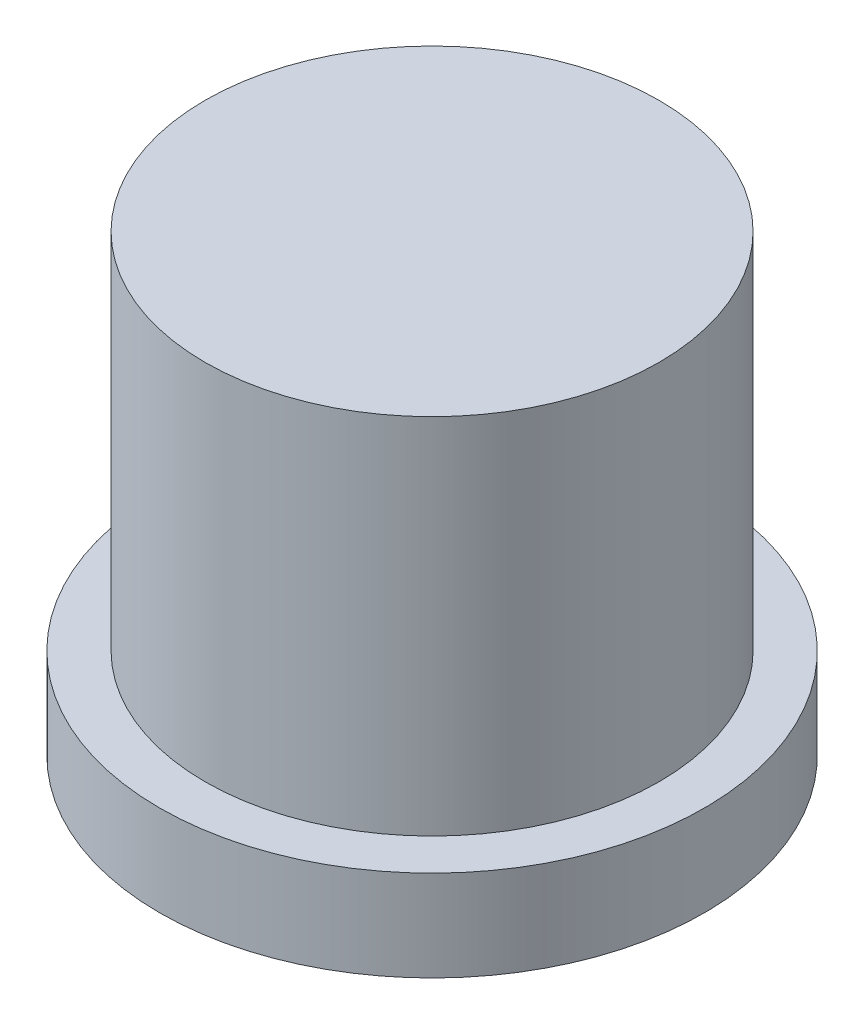
ISO-10303-21;
HEADER;
FILE_DESCRIPTION(('STEP AP214'),'2;1');
FILE_NAME('part.step','',(''),(''),'','','');
FILE_SCHEMA(('AUTOMOTIVE_DESIGN { 1 0 10303 214 1 1 1 1 }'));
ENDSEC;
DATA;
#1=APPLICATION_CONTEXT('core data for automotive mechanical design processes');
#2=APPLICATION_PROTOCOL_DEFINITION('international standard','automotive_design',2000,#1);
#3=PRODUCT_CONTEXT('',#1,'mechanical');
#4=PRODUCT('Part','Part','',(#3));
#5=PRODUCT_RELATED_PRODUCT_CATEGORY('part','',(#4));
#6=PRODUCT_DEFINITION_FORMATION('','',#4);
#7=PRODUCT_DEFINITION_CONTEXT('part definition',#1,'design');
#8=PRODUCT_DEFINITION('design','',#6,#7);
#9=PRODUCT_DEFINITION_SHAPE('','',#8);
#10=(LENGTH_UNIT() NAMED_UNIT(*) SI_UNIT(.MILLI.,.METRE.));
#11=(NAMED_UNIT(*) PLANE_ANGLE_UNIT() SI_UNIT($,.RADIAN.));
#12=(NAMED_UNIT(*) SI_UNIT($,.STERADIAN.) SOLID_ANGLE_UNIT());
#13=UNCERTAINTY_MEASURE_WITH_UNIT(LENGTH_MEASURE(1.E-05),#10,'distance_accuracy_value','');
#14=(GEOMETRIC_REPRESENTATION_CONTEXT(3) GLOBAL_UNCERTAINTY_ASSIGNED_CONTEXT((#13)) GLOBAL_UNIT_ASSIGNED_CONTEXT((#10,
#11,#12)) REPRESENTATION_CONTEXT('',''));
#15=CARTESIAN_POINT('',(0.,0.,0.));
#16=DIRECTION('',(0.,0.,1.));
#17=DIRECTION('',(1.,0.,0.));
#18=AXIS2_PLACEMENT_3D('',#15,#16,#17);
#19=CARTESIAN_POINT('',(0.,10.,0.));
#20=DIRECTION('',(0.,-1.,0.));
#21=DIRECTION('',(0.,0.,-1.));
#22=AXIS2_PLACEMENT_3D('',#19,#20,#21);
#23=CYLINDRICAL_SURFACE('',#22,5.);
#24=CARTESIAN_POINT('',(0.,2.,0.));
#25=DIRECTION('',(0.,1.,0.));
#26=DIRECTION('',(0.,0.,1.));
#27=AXIS2_PLACEMENT_3D('',#24,#25,#26);
#28=CIRCLE('',#27,5.);
#29=CARTESIAN_POINT('',(0.,2.,5.));
#30=VERTEX_POINT('',#29);
#31=EDGE_CURVE('E49',#30,#30,#28,.T.);
#32=ORIENTED_EDGE('',*,*,#31,.T.);
#33=EDGE_LOOP('',(#32));
#34=FACE_BOUND('',#33,.T.);
#35=CARTESIAN_POINT('',(0.,10.,0.));
#36=DIRECTION('',(0.,1.,0.));
#37=DIRECTION('',(0.,0.,1.));
#38=AXIS2_PLACEMENT_3D('',#35,#36,#37);
#39=CIRCLE('',#38,5.);
#40=CARTESIAN_POINT('',(0.,10.,5.));
#41=VERTEX_POINT('',#40);
#42=EDGE_CURVE('E10',#41,#41,#39,.T.);
#43=ORIENTED_EDGE('',*,*,#42,.F.);
#44=EDGE_LOOP('',(#43));
#45=FACE_BOUND('',#44,.T.);
#46=ADVANCED_FACE('F34',(#34,#45),#23,.T.);
#47=CARTESIAN_POINT('',(0.,10.,0.));
#48=DIRECTION('',(0.,1.,0.));
#49=DIRECTION('',(0.,0.,1.));
#50=AXIS2_PLACEMENT_3D('',#47,#48,#49);
#51=PLANE('',#50);
#52=ORIENTED_EDGE('',*,*,#42,.T.);
#53=EDGE_LOOP('',(#52));
#54=FACE_BOUND('',#53,.T.);
#55=ADVANCED_FACE('F59',(#54),#51,.T.);
#56=CARTESIAN_POINT('',(0.,2.,0.));
#57=DIRECTION('',(0.,1.,0.));
#58=DIRECTION('',(0.,0.,1.));
#59=AXIS2_PLACEMENT_3D('',#56,#57,#58);
#60=PLANE('',#59);
#61=CARTESIAN_POINT('',(0.,2.,0.));
#62=DIRECTION('',(0.,1.,0.));
#63=DIRECTION('',(0.,0.,1.));
#64=AXIS2_PLACEMENT_3D('',#61,#62,#63);
#65=CIRCLE('',#64,6.);
#66=CARTESIAN_POINT('',(0.,2.,6.));
#67=VERTEX_POINT('',#66);
#68=EDGE_CURVE('E40',#67,#67,#65,.T.);
#69=ORIENTED_EDGE('',*,*,#68,.T.);
#70=EDGE_LOOP('',(#69));
#71=FACE_BOUND('',#70,.T.);
#72=ORIENTED_EDGE('',*,*,#31,.F.);
#73=EDGE_LOOP('',(#72));
#74=FACE_BOUND('',#73,.T.);
#75=ADVANCED_FACE('F56',(#71,#74),#60,.T.);
#76=CARTESIAN_POINT('',(0.,2.,0.));
#77=DIRECTION('',(0.,-1.,0.));
#78=DIRECTION('',(0.,0.,-1.));
#79=AXIS2_PLACEMENT_3D('',#76,#77,#78);
#80=CYLINDRICAL_SURFACE('',#79,6.);
#81=ORIENTED_EDGE('',*,*,#68,.F.);
#82=EDGE_LOOP('',(#81));
#83=FACE_BOUND('',#82,.T.);
#84=CARTESIAN_POINT('',(0.,0.,0.));
#85=DIRECTION('',(0.,1.,0.));
#86=DIRECTION('',(0.,0.,1.));
#87=AXIS2_PLACEMENT_3D('',#84,#85,#86);
#88=CIRCLE('',#87,6.);
#89=CARTESIAN_POINT('',(0.,0.,6.));
#90=VERTEX_POINT('',#89);
#91=EDGE_CURVE('E44',#90,#90,#88,.T.);
#92=ORIENTED_EDGE('',*,*,#91,.T.);
#93=EDGE_LOOP('',(#92));
#94=FACE_BOUND('',#93,.T.);
#95=ADVANCED_FACE('F58',(#83,#94),#80,.T.);
#96=CARTESIAN_POINT('',(0.,0.,0.));
#97=DIRECTION('',(0.,1.,0.));
#98=DIRECTION('',(0.,0.,1.));
#99=AXIS2_PLACEMENT_3D('',#96,#97,#98);
#100=PLANE('',#99);
#101=ORIENTED_EDGE('',*,*,#91,.F.);
#102=EDGE_LOOP('',(#101));
#103=FACE_BOUND('',#102,.T.);
#104=ADVANCED_FACE('F65',(#103),#100,.F.);
#105=CLOSED_SHELL('',(#46,#55,#75,#95,#104));
#106=MANIFOLD_SOLID_BREP('B2',#105);
#107=ADVANCED_BREP_SHAPE_REPRESENTATION('',(#18,#106),#14);
#108=SHAPE_DEFINITION_REPRESENTATION(#9,#107);
ENDSEC;
END-ISO-10303-21;
